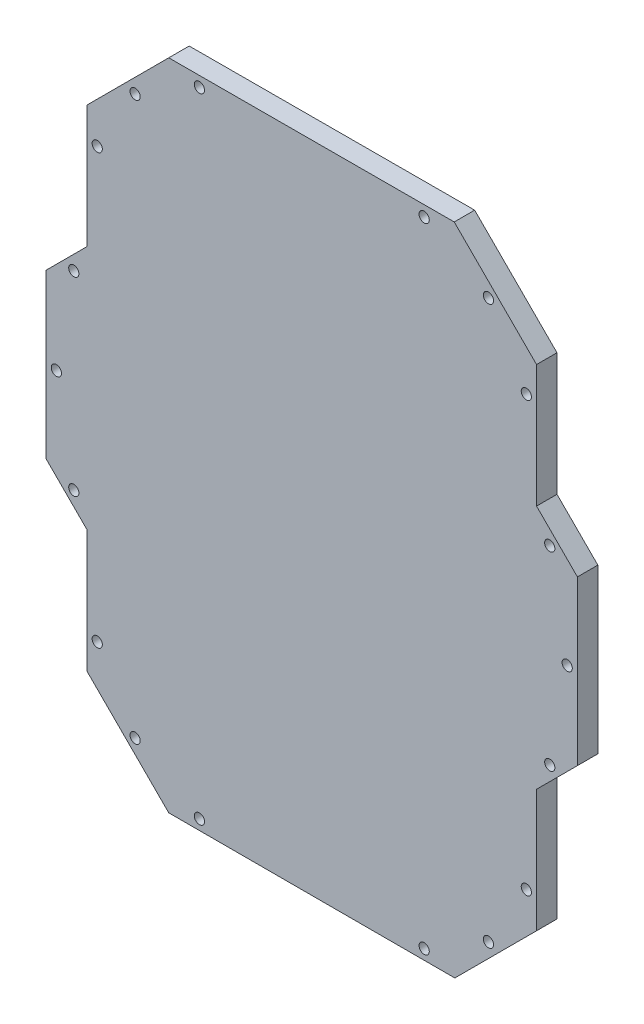
ISO-10303-21;
HEADER;
FILE_DESCRIPTION(('STEP AP214'),'2;1');
FILE_NAME('part.step','',(''),(''),'','','');
FILE_SCHEMA(('AUTOMOTIVE_DESIGN { 1 0 10303 214 1 1 1 1 }'));
ENDSEC;
DATA;
#1=APPLICATION_CONTEXT('core data for automotive mechanical design processes');
#2=APPLICATION_PROTOCOL_DEFINITION('international standard','automotive_design',2000,#1);
#3=PRODUCT_CONTEXT('',#1,'mechanical');
#4=PRODUCT('Part','Part','',(#3));
#5=PRODUCT_RELATED_PRODUCT_CATEGORY('part','',(#4));
#6=PRODUCT_DEFINITION_FORMATION('','',#4);
#7=PRODUCT_DEFINITION_CONTEXT('part definition',#1,'design');
#8=PRODUCT_DEFINITION('design','',#6,#7);
#9=PRODUCT_DEFINITION_SHAPE('','',#8);
#10=(LENGTH_UNIT() NAMED_UNIT(*) SI_UNIT(.MILLI.,.METRE.));
#11=(NAMED_UNIT(*) PLANE_ANGLE_UNIT() SI_UNIT($,.RADIAN.));
#12=(NAMED_UNIT(*) SI_UNIT($,.STERADIAN.) SOLID_ANGLE_UNIT());
#13=UNCERTAINTY_MEASURE_WITH_UNIT(LENGTH_MEASURE(1.E-05),#10,'distance_accuracy_value','');
#14=(GEOMETRIC_REPRESENTATION_CONTEXT(3) GLOBAL_UNCERTAINTY_ASSIGNED_CONTEXT((#13)) GLOBAL_UNIT_ASSIGNED_CONTEXT((#10,
#11,#12)) REPRESENTATION_CONTEXT('',''));
#15=CARTESIAN_POINT('',(0.,0.,0.));
#16=DIRECTION('',(0.,0.,1.));
#17=DIRECTION('',(1.,0.,0.));
#18=AXIS2_PLACEMENT_3D('',#15,#16,#17);
#19=CARTESIAN_POINT('',(0.,0.,5.));
#20=DIRECTION('',(0.,0.,1.));
#21=DIRECTION('',(1.,0.,0.));
#22=AXIS2_PLACEMENT_3D('',#19,#20,#21);
#23=PLANE('',#22);
#24=CARTESIAN_POINT('',(132.555071144139,83.7197596237895,5.));
#25=DIRECTION('',(0.,0.,1.));
#26=DIRECTION('',(1.,0.,0.));
#27=AXIS2_PLACEMENT_3D('',#24,#25,#26);
#28=CIRCLE('',#27,1.25);
#29=CARTESIAN_POINT('',(133.805071144139,83.7197596237895,5.));
#30=VERTEX_POINT('',#29);
#31=EDGE_CURVE('E452',#30,#30,#28,.T.);
#32=ORIENTED_EDGE('',*,*,#31,.F.);
#33=EDGE_LOOP('',(#32));
#34=FACE_BOUND('',#33,.T.);
#35=CARTESIAN_POINT('',(11.8228380971051,106.951992670823,5.));
#36=DIRECTION('',(0.,0.,1.));
#37=DIRECTION('',(1.,0.,0.));
#38=AXIS2_PLACEMENT_3D('',#35,#36,#37);
#39=CIRCLE('',#38,1.25);
#40=CARTESIAN_POINT('',(13.0728380971051,106.951992670823,5.));
#41=VERTEX_POINT('',#40);
#42=EDGE_CURVE('E468',#41,#41,#39,.T.);
#43=ORIENTED_EDGE('',*,*,#42,.F.);
#44=EDGE_LOOP('',(#43));
#45=FACE_BOUND('',#44,.T.);
#46=CARTESIAN_POINT('',(11.8228380971051,60.4875265767559,5.));
#47=DIRECTION('',(0.,0.,1.));
#48=DIRECTION('',(1.,0.,0.));
#49=AXIS2_PLACEMENT_3D('',#46,#47,#48);
#50=CIRCLE('',#49,1.25);
#51=CARTESIAN_POINT('',(13.0728380971051,60.4875265767559,5.));
#52=VERTEX_POINT('',#51);
#53=EDGE_CURVE('E484',#52,#52,#50,.T.);
#54=ORIENTED_EDGE('',*,*,#53,.F.);
#55=EDGE_LOOP('',(#54));
#56=FACE_BOUND('',#55,.T.);
#57=CARTESIAN_POINT('',(17.5550711441387,136.21975962379,5.));
#58=DIRECTION('',(0.,0.,1.));
#59=DIRECTION('',(1.,0.,0.));
#60=AXIS2_PLACEMENT_3D('',#57,#58,#59);
#61=CIRCLE('',#60,1.25);
#62=CARTESIAN_POINT('',(18.8050711441387,136.21975962379,5.));
#63=VERTEX_POINT('',#62);
#64=EDGE_CURVE('E500',#63,#63,#61,.T.);
#65=ORIENTED_EDGE('',*,*,#64,.F.);
#66=EDGE_LOOP('',(#65));
#67=FACE_BOUND('',#66,.T.);
#68=CARTESIAN_POINT('',(113.287304191172,151.951992670823,5.));
#69=DIRECTION('',(0.,0.,1.));
#70=DIRECTION('',(1.,0.,0.));
#71=AXIS2_PLACEMENT_3D('',#68,#69,#70);
#72=CIRCLE('',#71,1.25);
#73=CARTESIAN_POINT('',(114.537304191172,151.951992670823,5.));
#74=VERTEX_POINT('',#73);
#75=EDGE_CURVE('E516',#74,#74,#72,.T.);
#76=ORIENTED_EDGE('',*,*,#75,.F.);
#77=EDGE_LOOP('',(#76));
#78=FACE_BOUND('',#77,.T.);
#79=CARTESIAN_POINT('',(97.5550711441387,161.21975962379,5.));
#80=DIRECTION('',(0.,0.,1.));
#81=DIRECTION('',(1.,0.,0.));
#82=AXIS2_PLACEMENT_3D('',#79,#80,#81);
#83=CIRCLE('',#82,1.25);
#84=CARTESIAN_POINT('',(98.8050711441387,161.21975962379,5.));
#85=VERTEX_POINT('',#84);
#86=EDGE_CURVE('E532',#85,#85,#83,.T.);
#87=ORIENTED_EDGE('',*,*,#86,.F.);
#88=EDGE_LOOP('',(#87));
#89=FACE_BOUND('',#88,.T.);
#90=CARTESIAN_POINT('',(17.5550711441387,31.2197596237895,5.));
#91=DIRECTION('',(0.,0.,1.));
#92=DIRECTION('',(1.,0.,0.));
#93=AXIS2_PLACEMENT_3D('',#90,#91,#92);
#94=CIRCLE('',#93,1.25);
#95=CARTESIAN_POINT('',(18.8050711441387,31.2197596237895,5.));
#96=VERTEX_POINT('',#95);
#97=EDGE_CURVE('E548',#96,#96,#94,.T.);
#98=ORIENTED_EDGE('',*,*,#97,.F.);
#99=EDGE_LOOP('',(#98));
#100=FACE_BOUND('',#99,.T.);
#101=CARTESIAN_POINT('',(113.287304191172,15.4875265767559,5.));
#102=DIRECTION('',(0.,0.,1.));
#103=DIRECTION('',(1.,0.,0.));
#104=AXIS2_PLACEMENT_3D('',#101,#102,#103);
#105=CIRCLE('',#104,1.25);
#106=CARTESIAN_POINT('',(114.537304191172,15.4875265767559,5.));
#107=VERTEX_POINT('',#106);
#108=EDGE_CURVE('E564',#107,#107,#105,.T.);
#109=ORIENTED_EDGE('',*,*,#108,.F.);
#110=EDGE_LOOP('',(#109));
#111=FACE_BOUND('',#110,.T.);
#112=CARTESIAN_POINT('',(97.5550711441387,6.2197596237895,5.));
#113=DIRECTION('',(0.,0.,1.));
#114=DIRECTION('',(1.,0.,0.));
#115=AXIS2_PLACEMENT_3D('',#112,#113,#114);
#116=CIRCLE('',#115,1.25);
#117=CARTESIAN_POINT('',(98.8050711441387,6.2197596237895,5.));
#118=VERTEX_POINT('',#117);
#119=EDGE_CURVE('E194',#118,#118,#116,.T.);
#120=ORIENTED_EDGE('',*,*,#119,.F.);
#121=EDGE_LOOP('',(#120));
#122=FACE_BOUND('',#121,.T.);
#123=DIRECTION('',(1.,0.,0.));
#124=VECTOR('',#123,1.);
#125=CARTESIAN_POINT('',(35.0550711441387,3.7197596237895,5.));
#126=LINE('',#125,#124);
#127=CARTESIAN_POINT('',(35.0550711441387,3.7197596237895,5.));
#128=VERTEX_POINT('',#127);
#129=CARTESIAN_POINT('',(105.055071144139,3.7197596237895,5.));
#130=VERTEX_POINT('',#129);
#131=EDGE_CURVE('E236',#128,#130,#126,.T.);
#132=ORIENTED_EDGE('',*,*,#131,.T.);
#133=DIRECTION('',(0.707106781186548,0.707106781186547,0.));
#134=VECTOR('',#133,1.);
#135=CARTESIAN_POINT('',(105.055071144139,3.7197596237895,5.));
#136=LINE('',#135,#134);
#137=CARTESIAN_POINT('',(125.055071144139,23.7197596237895,5.));
#138=VERTEX_POINT('',#137);
#139=EDGE_CURVE('E124',#130,#138,#136,.T.);
#140=ORIENTED_EDGE('',*,*,#139,.T.);
#141=DIRECTION('',(0.,1.,0.));
#142=VECTOR('',#141,1.);
#143=CARTESIAN_POINT('',(125.055071144139,23.7197596237895,5.));
#144=LINE('',#143,#142);
#145=CARTESIAN_POINT('',(125.055071144139,53.7197596237895,5.));
#146=VERTEX_POINT('',#145);
#147=EDGE_CURVE('E289',#138,#146,#144,.T.);
#148=ORIENTED_EDGE('',*,*,#147,.T.);
#149=DIRECTION('',(0.707106781186546,0.707106781186548,0.));
#150=VECTOR('',#149,1.);
#151=CARTESIAN_POINT('',(135.055071144139,63.7197596237895,5.));
#152=LINE('',#151,#150);
#153=CARTESIAN_POINT('',(135.055071144139,63.7197596237895,5.));
#154=VERTEX_POINT('',#153);
#155=EDGE_CURVE('E309',#146,#154,#152,.T.);
#156=ORIENTED_EDGE('',*,*,#155,.T.);
#157=DIRECTION('',(0.,1.,0.));
#158=VECTOR('',#157,1.);
#159=CARTESIAN_POINT('',(135.055071144139,63.7197596237895,5.));
#160=LINE('',#159,#158);
#161=CARTESIAN_POINT('',(135.055071144139,103.71975962379,5.));
#162=VERTEX_POINT('',#161);
#163=EDGE_CURVE('E305',#154,#162,#160,.T.);
#164=ORIENTED_EDGE('',*,*,#163,.T.);
#165=DIRECTION('',(-0.707106781186546,0.707106781186548,0.));
#166=VECTOR('',#165,1.);
#167=CARTESIAN_POINT('',(135.055071144139,103.71975962379,5.));
#168=LINE('',#167,#166);
#169=CARTESIAN_POINT('',(125.055071144139,113.71975962379,5.));
#170=VERTEX_POINT('',#169);
#171=EDGE_CURVE('E308',#162,#170,#168,.T.);
#172=ORIENTED_EDGE('',*,*,#171,.T.);
#173=DIRECTION('',(0.,1.,0.));
#174=VECTOR('',#173,1.);
#175=CARTESIAN_POINT('',(125.055071144139,143.71975962379,5.));
#176=LINE('',#175,#174);
#177=CARTESIAN_POINT('',(125.055071144139,143.71975962379,5.));
#178=VERTEX_POINT('',#177);
#179=EDGE_CURVE('E313',#170,#178,#176,.T.);
#180=ORIENTED_EDGE('',*,*,#179,.T.);
#181=DIRECTION('',(-0.707106781186548,0.707106781186547,0.));
#182=VECTOR('',#181,1.);
#183=CARTESIAN_POINT('',(104.90983924524,163.864991522689,5.));
#184=LINE('',#183,#182);
#185=CARTESIAN_POINT('',(104.90983924524,163.864991522689,5.));
#186=VERTEX_POINT('',#185);
#187=EDGE_CURVE('E320',#178,#186,#184,.T.);
#188=ORIENTED_EDGE('',*,*,#187,.T.);
#189=DIRECTION('',(-0.999997948982941,-0.00202534686193715,0.));
#190=VECTOR('',#189,1.);
#191=CARTESIAN_POINT('',(35.0588302309645,163.723518710615,5.));
#192=LINE('',#191,#190);
#193=CARTESIAN_POINT('',(35.0588302309645,163.723518710615,5.));
#194=VERTEX_POINT('',#193);
#195=EDGE_CURVE('E323',#186,#194,#192,.T.);
#196=ORIENTED_EDGE('',*,*,#195,.T.);
#197=DIRECTION('',(-0.707106781186548,-0.707106781186548,0.));
#198=VECTOR('',#197,1.);
#199=CARTESIAN_POINT('',(35.0588302309645,163.723518710615,5.));
#200=LINE('',#199,#198);
#201=CARTESIAN_POINT('',(15.0550711441387,143.71975962379,5.));
#202=VERTEX_POINT('',#201);
#203=EDGE_CURVE('E326',#194,#202,#200,.T.);
#204=ORIENTED_EDGE('',*,*,#203,.T.);
#205=DIRECTION('',(0.,-1.,0.));
#206=VECTOR('',#205,1.);
#207=CARTESIAN_POINT('',(15.0550711441387,143.71975962379,5.));
#208=LINE('',#207,#206);
#209=CARTESIAN_POINT('',(15.0550711441387,113.71975962379,5.));
#210=VERTEX_POINT('',#209);
#211=EDGE_CURVE('E329',#202,#210,#208,.T.);
#212=ORIENTED_EDGE('',*,*,#211,.T.);
#213=DIRECTION('',(-0.707106781186547,-0.707106781186548,0.));
#214=VECTOR('',#213,1.);
#215=CARTESIAN_POINT('',(5.05507114413874,103.71975962379,5.));
#216=LINE('',#215,#214);
#217=CARTESIAN_POINT('',(5.05507114413874,103.71975962379,5.));
#218=VERTEX_POINT('',#217);
#219=EDGE_CURVE('E332',#210,#218,#216,.T.);
#220=ORIENTED_EDGE('',*,*,#219,.T.);
#221=DIRECTION('',(0.,-1.,0.));
#222=VECTOR('',#221,1.);
#223=CARTESIAN_POINT('',(5.05507114413874,63.7197596237895,5.));
#224=LINE('',#223,#222);
#225=CARTESIAN_POINT('',(5.05507114413874,63.7197596237895,5.));
#226=VERTEX_POINT('',#225);
#227=EDGE_CURVE('E167',#218,#226,#224,.T.);
#228=ORIENTED_EDGE('',*,*,#227,.T.);
#229=DIRECTION('',(0.707106781186547,-0.707106781186548,0.));
#230=VECTOR('',#229,1.);
#231=CARTESIAN_POINT('',(5.05507114413874,63.7197596237895,5.));
#232=LINE('',#231,#230);
#233=CARTESIAN_POINT('',(15.0550711441387,53.7197596237895,5.));
#234=VERTEX_POINT('',#233);
#235=EDGE_CURVE('E161',#226,#234,#232,.T.);
#236=ORIENTED_EDGE('',*,*,#235,.T.);
#237=DIRECTION('',(0.,-1.,0.));
#238=VECTOR('',#237,1.);
#239=CARTESIAN_POINT('',(15.0550711441387,23.7197596237895,5.));
#240=LINE('',#239,#238);
#241=CARTESIAN_POINT('',(15.0550711441387,23.7197596237895,5.));
#242=VERTEX_POINT('',#241);
#243=EDGE_CURVE('E165',#234,#242,#240,.T.);
#244=ORIENTED_EDGE('',*,*,#243,.T.);
#245=DIRECTION('',(0.707106781186547,-0.707106781186548,0.));
#246=VECTOR('',#245,1.);
#247=CARTESIAN_POINT('',(35.0550711441387,3.7197596237895,5.));
#248=LINE('',#247,#246);
#249=EDGE_CURVE('E57',#242,#128,#248,.T.);
#250=ORIENTED_EDGE('',*,*,#249,.T.);
#251=EDGE_LOOP('',(#132,#140,#148,#156,#164,#172,#180,#188,#196,#204,#212,#220,#228,#236,#244,#250));
#252=FACE_BOUND('',#251,.T.);
#253=CARTESIAN_POINT('',(122.555071144139,31.2197596237895,5.));
#254=DIRECTION('',(0.,0.,1.));
#255=DIRECTION('',(1.,0.,0.));
#256=AXIS2_PLACEMENT_3D('',#253,#254,#255);
#257=CIRCLE('',#256,1.25);
#258=CARTESIAN_POINT('',(123.805071144139,31.2197596237895,5.));
#259=VERTEX_POINT('',#258);
#260=EDGE_CURVE('E572',#259,#259,#257,.T.);
#261=ORIENTED_EDGE('',*,*,#260,.F.);
#262=EDGE_LOOP('',(#261));
#263=FACE_BOUND('',#262,.T.);
#264=CARTESIAN_POINT('',(42.5550711441387,6.2197596237895,5.));
#265=DIRECTION('',(0.,0.,1.));
#266=DIRECTION('',(1.,0.,0.));
#267=AXIS2_PLACEMENT_3D('',#264,#265,#266);
#268=CIRCLE('',#267,1.25);
#269=CARTESIAN_POINT('',(43.8050711441387,6.2197596237895,5.));
#270=VERTEX_POINT('',#269);
#271=EDGE_CURVE('E556',#270,#270,#268,.T.);
#272=ORIENTED_EDGE('',*,*,#271,.F.);
#273=EDGE_LOOP('',(#272));
#274=FACE_BOUND('',#273,.T.);
#275=CARTESIAN_POINT('',(26.8228380971051,15.4875265767559,5.));
#276=DIRECTION('',(0.,0.,1.));
#277=DIRECTION('',(1.,0.,0.));
#278=AXIS2_PLACEMENT_3D('',#275,#276,#277);
#279=CIRCLE('',#278,1.25);
#280=CARTESIAN_POINT('',(28.0728380971051,15.4875265767559,5.));
#281=VERTEX_POINT('',#280);
#282=EDGE_CURVE('E540',#281,#281,#279,.T.);
#283=ORIENTED_EDGE('',*,*,#282,.F.);
#284=EDGE_LOOP('',(#283));
#285=FACE_BOUND('',#284,.T.);
#286=CARTESIAN_POINT('',(122.555071144139,136.21975962379,5.));
#287=DIRECTION('',(0.,0.,1.));
#288=DIRECTION('',(1.,0.,0.));
#289=AXIS2_PLACEMENT_3D('',#286,#287,#288);
#290=CIRCLE('',#289,1.25);
#291=CARTESIAN_POINT('',(123.805071144139,136.21975962379,5.));
#292=VERTEX_POINT('',#291);
#293=EDGE_CURVE('E524',#292,#292,#290,.T.);
#294=ORIENTED_EDGE('',*,*,#293,.F.);
#295=EDGE_LOOP('',(#294));
#296=FACE_BOUND('',#295,.T.);
#297=CARTESIAN_POINT('',(42.5550711441387,161.21975962379,5.));
#298=DIRECTION('',(0.,0.,1.));
#299=DIRECTION('',(1.,0.,0.));
#300=AXIS2_PLACEMENT_3D('',#297,#298,#299);
#301=CIRCLE('',#300,1.25);
#302=CARTESIAN_POINT('',(43.8050711441387,161.21975962379,5.));
#303=VERTEX_POINT('',#302);
#304=EDGE_CURVE('E508',#303,#303,#301,.T.);
#305=ORIENTED_EDGE('',*,*,#304,.F.);
#306=EDGE_LOOP('',(#305));
#307=FACE_BOUND('',#306,.T.);
#308=CARTESIAN_POINT('',(26.8228380971051,151.951992670823,5.));
#309=DIRECTION('',(0.,0.,1.));
#310=DIRECTION('',(1.,0.,0.));
#311=AXIS2_PLACEMENT_3D('',#308,#309,#310);
#312=CIRCLE('',#311,1.25);
#313=CARTESIAN_POINT('',(28.0728380971051,151.951992670823,5.));
#314=VERTEX_POINT('',#313);
#315=EDGE_CURVE('E492',#314,#314,#312,.T.);
#316=ORIENTED_EDGE('',*,*,#315,.F.);
#317=EDGE_LOOP('',(#316));
#318=FACE_BOUND('',#317,.T.);
#319=CARTESIAN_POINT('',(7.55507114413874,83.7197596237895,5.));
#320=DIRECTION('',(0.,0.,1.));
#321=DIRECTION('',(1.,0.,0.));
#322=AXIS2_PLACEMENT_3D('',#319,#320,#321);
#323=CIRCLE('',#322,1.25);
#324=CARTESIAN_POINT('',(8.80507114413874,83.7197596237895,5.));
#325=VERTEX_POINT('',#324);
#326=EDGE_CURVE('E476',#325,#325,#323,.T.);
#327=ORIENTED_EDGE('',*,*,#326,.F.);
#328=EDGE_LOOP('',(#327));
#329=FACE_BOUND('',#328,.T.);
#330=CARTESIAN_POINT('',(128.287304191172,60.4875265767559,5.));
#331=DIRECTION('',(0.,0.,1.));
#332=DIRECTION('',(1.,0.,0.));
#333=AXIS2_PLACEMENT_3D('',#330,#331,#332);
#334=CIRCLE('',#333,1.25);
#335=CARTESIAN_POINT('',(129.537304191172,60.4875265767559,5.));
#336=VERTEX_POINT('',#335);
#337=EDGE_CURVE('E460',#336,#336,#334,.T.);
#338=ORIENTED_EDGE('',*,*,#337,.F.);
#339=EDGE_LOOP('',(#338));
#340=FACE_BOUND('',#339,.T.);
#341=CARTESIAN_POINT('',(128.287304191172,106.951992670823,5.));
#342=DIRECTION('',(0.,0.,1.));
#343=DIRECTION('',(1.,0.,0.));
#344=AXIS2_PLACEMENT_3D('',#341,#342,#343);
#345=CIRCLE('',#344,1.25);
#346=CARTESIAN_POINT('',(129.537304191172,106.951992670823,5.));
#347=VERTEX_POINT('',#346);
#348=EDGE_CURVE('E441',#347,#347,#345,.T.);
#349=ORIENTED_EDGE('',*,*,#348,.F.);
#350=EDGE_LOOP('',(#349));
#351=FACE_BOUND('',#350,.T.);
#352=ADVANCED_FACE('F39',(#34,#45,#56,#67,#78,#89,#100,#111,#122,#252,#263,#274,#285,#296,#307,
#318,#329,#340,#351),#23,.T.);
#353=CARTESIAN_POINT('',(0.,0.,0.));
#354=DIRECTION('',(0.,0.,1.));
#355=DIRECTION('',(1.,0.,0.));
#356=AXIS2_PLACEMENT_3D('',#353,#354,#355);
#357=PLANE('',#356);
#358=DIRECTION('',(1.,0.,0.));
#359=VECTOR('',#358,1.);
#360=CARTESIAN_POINT('',(35.0550711441387,3.7197596237895,0.));
#361=LINE('',#360,#359);
#362=CARTESIAN_POINT('',(35.0550711441387,3.7197596237895,0.));
#363=VERTEX_POINT('',#362);
#364=CARTESIAN_POINT('',(105.055071144139,3.7197596237895,0.));
#365=VERTEX_POINT('',#364);
#366=EDGE_CURVE('E189',#363,#365,#361,.T.);
#367=ORIENTED_EDGE('',*,*,#366,.F.);
#368=DIRECTION('',(0.707106781186547,-0.707106781186548,0.));
#369=VECTOR('',#368,1.);
#370=CARTESIAN_POINT('',(35.0550711441387,3.7197596237895,0.));
#371=LINE('',#370,#369);
#372=CARTESIAN_POINT('',(15.0550711441387,23.7197596237895,0.));
#373=VERTEX_POINT('',#372);
#374=EDGE_CURVE('E116',#373,#363,#371,.T.);
#375=ORIENTED_EDGE('',*,*,#374,.F.);
#376=DIRECTION('',(0.,-1.,0.));
#377=VECTOR('',#376,1.);
#378=CARTESIAN_POINT('',(15.0550711441387,23.7197596237895,0.));
#379=LINE('',#378,#377);
#380=CARTESIAN_POINT('',(15.0550711441387,53.7197596237895,0.));
#381=VERTEX_POINT('',#380);
#382=EDGE_CURVE('E110',#381,#373,#379,.T.);
#383=ORIENTED_EDGE('',*,*,#382,.F.);
#384=DIRECTION('',(0.707106781186547,-0.707106781186548,0.));
#385=VECTOR('',#384,1.);
#386=CARTESIAN_POINT('',(5.05507114413874,63.7197596237895,0.));
#387=LINE('',#386,#385);
#388=CARTESIAN_POINT('',(5.05507114413874,63.7197596237895,0.));
#389=VERTEX_POINT('',#388);
#390=EDGE_CURVE('E176',#389,#381,#387,.T.);
#391=ORIENTED_EDGE('',*,*,#390,.F.);
#392=DIRECTION('',(0.,-1.,0.));
#393=VECTOR('',#392,1.);
#394=CARTESIAN_POINT('',(5.05507114413874,63.7197596237895,0.));
#395=LINE('',#394,#393);
#396=CARTESIAN_POINT('',(5.05507114413874,103.71975962379,0.));
#397=VERTEX_POINT('',#396);
#398=EDGE_CURVE('E227',#397,#389,#395,.T.);
#399=ORIENTED_EDGE('',*,*,#398,.F.);
#400=DIRECTION('',(-0.707106781186547,-0.707106781186548,0.));
#401=VECTOR('',#400,1.);
#402=CARTESIAN_POINT('',(5.05507114413874,103.71975962379,0.));
#403=LINE('',#402,#401);
#404=CARTESIAN_POINT('',(15.0550711441387,113.71975962379,0.));
#405=VERTEX_POINT('',#404);
#406=EDGE_CURVE('E224',#405,#397,#403,.T.);
#407=ORIENTED_EDGE('',*,*,#406,.F.);
#408=DIRECTION('',(0.,-1.,0.));
#409=VECTOR('',#408,1.);
#410=CARTESIAN_POINT('',(15.0550711441387,143.71975962379,0.));
#411=LINE('',#410,#409);
#412=CARTESIAN_POINT('',(15.0550711441387,143.71975962379,0.));
#413=VERTEX_POINT('',#412);
#414=EDGE_CURVE('E221',#413,#405,#411,.T.);
#415=ORIENTED_EDGE('',*,*,#414,.F.);
#416=DIRECTION('',(-0.707106781186548,-0.707106781186548,0.));
#417=VECTOR('',#416,1.);
#418=CARTESIAN_POINT('',(35.0588302309645,163.723518710615,0.));
#419=LINE('',#418,#417);
#420=CARTESIAN_POINT('',(35.0588302309645,163.723518710615,0.));
#421=VERTEX_POINT('',#420);
#422=EDGE_CURVE('E218',#421,#413,#419,.T.);
#423=ORIENTED_EDGE('',*,*,#422,.F.);
#424=DIRECTION('',(-0.999997948982941,-0.00202534686193715,0.));
#425=VECTOR('',#424,1.);
#426=CARTESIAN_POINT('',(35.0588302309645,163.723518710615,0.));
#427=LINE('',#426,#425);
#428=CARTESIAN_POINT('',(104.90983924524,163.864991522689,0.));
#429=VERTEX_POINT('',#428);
#430=EDGE_CURVE('E215',#429,#421,#427,.T.);
#431=ORIENTED_EDGE('',*,*,#430,.F.);
#432=DIRECTION('',(-0.707106781186548,0.707106781186547,0.));
#433=VECTOR('',#432,1.);
#434=CARTESIAN_POINT('',(104.90983924524,163.864991522689,0.));
#435=LINE('',#434,#433);
#436=CARTESIAN_POINT('',(125.055071144139,143.71975962379,0.));
#437=VERTEX_POINT('',#436);
#438=EDGE_CURVE('E212',#437,#429,#435,.T.);
#439=ORIENTED_EDGE('',*,*,#438,.F.);
#440=DIRECTION('',(0.,1.,0.));
#441=VECTOR('',#440,1.);
#442=CARTESIAN_POINT('',(125.055071144139,143.71975962379,0.));
#443=LINE('',#442,#441);
#444=CARTESIAN_POINT('',(125.055071144139,113.71975962379,0.));
#445=VERTEX_POINT('',#444);
#446=EDGE_CURVE('E209',#445,#437,#443,.T.);
#447=ORIENTED_EDGE('',*,*,#446,.F.);
#448=DIRECTION('',(-0.707106781186546,0.707106781186548,0.));
#449=VECTOR('',#448,1.);
#450=CARTESIAN_POINT('',(135.055071144139,103.71975962379,0.));
#451=LINE('',#450,#449);
#452=CARTESIAN_POINT('',(135.055071144139,103.71975962379,0.));
#453=VERTEX_POINT('',#452);
#454=EDGE_CURVE('E206',#453,#445,#451,.T.);
#455=ORIENTED_EDGE('',*,*,#454,.F.);
#456=DIRECTION('',(0.,1.,0.));
#457=VECTOR('',#456,1.);
#458=CARTESIAN_POINT('',(135.055071144139,63.7197596237895,0.));
#459=LINE('',#458,#457);
#460=CARTESIAN_POINT('',(135.055071144139,63.7197596237895,0.));
#461=VERTEX_POINT('',#460);
#462=EDGE_CURVE('E203',#461,#453,#459,.T.);
#463=ORIENTED_EDGE('',*,*,#462,.F.);
#464=DIRECTION('',(0.707106781186546,0.707106781186548,0.));
#465=VECTOR('',#464,1.);
#466=CARTESIAN_POINT('',(135.055071144139,63.7197596237895,0.));
#467=LINE('',#466,#465);
#468=CARTESIAN_POINT('',(125.055071144139,53.7197596237895,0.));
#469=VERTEX_POINT('',#468);
#470=EDGE_CURVE('E200',#469,#461,#467,.T.);
#471=ORIENTED_EDGE('',*,*,#470,.F.);
#472=DIRECTION('',(0.,1.,0.));
#473=VECTOR('',#472,1.);
#474=CARTESIAN_POINT('',(125.055071144139,23.7197596237895,0.));
#475=LINE('',#474,#473);
#476=CARTESIAN_POINT('',(125.055071144139,23.7197596237895,0.));
#477=VERTEX_POINT('',#476);
#478=EDGE_CURVE('E197',#477,#469,#475,.T.);
#479=ORIENTED_EDGE('',*,*,#478,.F.);
#480=DIRECTION('',(0.707106781186548,0.707106781186547,0.));
#481=VECTOR('',#480,1.);
#482=CARTESIAN_POINT('',(105.055071144139,3.7197596237895,0.));
#483=LINE('',#482,#481);
#484=EDGE_CURVE('E193',#365,#477,#483,.T.);
#485=ORIENTED_EDGE('',*,*,#484,.F.);
#486=EDGE_LOOP('',(#367,#375,#383,#391,#399,#407,#415,#423,#431,#439,#447,#455,#463,#471,#479,#485));
#487=FACE_BOUND('',#486,.T.);
#488=CARTESIAN_POINT('',(97.5550711441387,6.2197596237895,0.));
#489=DIRECTION('',(0.,0.,1.));
#490=DIRECTION('',(1.,0.,0.));
#491=AXIS2_PLACEMENT_3D('',#488,#489,#490);
#492=CIRCLE('',#491,1.25);
#493=CARTESIAN_POINT('',(98.8050711441387,6.2197596237895,0.));
#494=VERTEX_POINT('',#493);
#495=EDGE_CURVE('E576',#494,#494,#492,.T.);
#496=ORIENTED_EDGE('',*,*,#495,.T.);
#497=EDGE_LOOP('',(#496));
#498=FACE_BOUND('',#497,.T.);
#499=CARTESIAN_POINT('',(122.555071144139,31.2197596237895,0.));
#500=DIRECTION('',(0.,0.,1.));
#501=DIRECTION('',(1.,0.,0.));
#502=AXIS2_PLACEMENT_3D('',#499,#500,#501);
#503=CIRCLE('',#502,1.25);
#504=CARTESIAN_POINT('',(123.805071144139,31.2197596237895,0.));
#505=VERTEX_POINT('',#504);
#506=EDGE_CURVE('E568',#505,#505,#503,.T.);
#507=ORIENTED_EDGE('',*,*,#506,.T.);
#508=EDGE_LOOP('',(#507));
#509=FACE_BOUND('',#508,.T.);
#510=CARTESIAN_POINT('',(113.287304191172,15.4875265767559,0.));
#511=DIRECTION('',(0.,0.,1.));
#512=DIRECTION('',(1.,0.,0.));
#513=AXIS2_PLACEMENT_3D('',#510,#511,#512);
#514=CIRCLE('',#513,1.25);
#515=CARTESIAN_POINT('',(114.537304191172,15.4875265767559,0.));
#516=VERTEX_POINT('',#515);
#517=EDGE_CURVE('E560',#516,#516,#514,.T.);
#518=ORIENTED_EDGE('',*,*,#517,.T.);
#519=EDGE_LOOP('',(#518));
#520=FACE_BOUND('',#519,.T.);
#521=CARTESIAN_POINT('',(42.5550711441387,6.2197596237895,0.));
#522=DIRECTION('',(0.,0.,1.));
#523=DIRECTION('',(1.,0.,0.));
#524=AXIS2_PLACEMENT_3D('',#521,#522,#523);
#525=CIRCLE('',#524,1.25);
#526=CARTESIAN_POINT('',(43.8050711441387,6.2197596237895,0.));
#527=VERTEX_POINT('',#526);
#528=EDGE_CURVE('E552',#527,#527,#525,.T.);
#529=ORIENTED_EDGE('',*,*,#528,.T.);
#530=EDGE_LOOP('',(#529));
#531=FACE_BOUND('',#530,.T.);
#532=CARTESIAN_POINT('',(17.5550711441387,31.2197596237895,0.));
#533=DIRECTION('',(0.,0.,1.));
#534=DIRECTION('',(1.,0.,0.));
#535=AXIS2_PLACEMENT_3D('',#532,#533,#534);
#536=CIRCLE('',#535,1.25);
#537=CARTESIAN_POINT('',(18.8050711441387,31.2197596237895,0.));
#538=VERTEX_POINT('',#537);
#539=EDGE_CURVE('E544',#538,#538,#536,.T.);
#540=ORIENTED_EDGE('',*,*,#539,.T.);
#541=EDGE_LOOP('',(#540));
#542=FACE_BOUND('',#541,.T.);
#543=CARTESIAN_POINT('',(26.8228380971051,15.4875265767559,0.));
#544=DIRECTION('',(0.,0.,1.));
#545=DIRECTION('',(1.,0.,0.));
#546=AXIS2_PLACEMENT_3D('',#543,#544,#545);
#547=CIRCLE('',#546,1.25);
#548=CARTESIAN_POINT('',(28.0728380971051,15.4875265767559,0.));
#549=VERTEX_POINT('',#548);
#550=EDGE_CURVE('E536',#549,#549,#547,.T.);
#551=ORIENTED_EDGE('',*,*,#550,.T.);
#552=EDGE_LOOP('',(#551));
#553=FACE_BOUND('',#552,.T.);
#554=CARTESIAN_POINT('',(97.5550711441387,161.21975962379,0.));
#555=DIRECTION('',(0.,0.,1.));
#556=DIRECTION('',(1.,0.,0.));
#557=AXIS2_PLACEMENT_3D('',#554,#555,#556);
#558=CIRCLE('',#557,1.25);
#559=CARTESIAN_POINT('',(98.8050711441387,161.21975962379,0.));
#560=VERTEX_POINT('',#559);
#561=EDGE_CURVE('E528',#560,#560,#558,.T.);
#562=ORIENTED_EDGE('',*,*,#561,.T.);
#563=EDGE_LOOP('',(#562));
#564=FACE_BOUND('',#563,.T.);
#565=CARTESIAN_POINT('',(122.555071144139,136.21975962379,0.));
#566=DIRECTION('',(0.,0.,1.));
#567=DIRECTION('',(1.,0.,0.));
#568=AXIS2_PLACEMENT_3D('',#565,#566,#567);
#569=CIRCLE('',#568,1.25);
#570=CARTESIAN_POINT('',(123.805071144139,136.21975962379,0.));
#571=VERTEX_POINT('',#570);
#572=EDGE_CURVE('E520',#571,#571,#569,.T.);
#573=ORIENTED_EDGE('',*,*,#572,.T.);
#574=EDGE_LOOP('',(#573));
#575=FACE_BOUND('',#574,.T.);
#576=CARTESIAN_POINT('',(113.287304191172,151.951992670823,0.));
#577=DIRECTION('',(0.,0.,1.));
#578=DIRECTION('',(1.,0.,0.));
#579=AXIS2_PLACEMENT_3D('',#576,#577,#578);
#580=CIRCLE('',#579,1.25);
#581=CARTESIAN_POINT('',(114.537304191172,151.951992670823,0.));
#582=VERTEX_POINT('',#581);
#583=EDGE_CURVE('E512',#582,#582,#580,.T.);
#584=ORIENTED_EDGE('',*,*,#583,.T.);
#585=EDGE_LOOP('',(#584));
#586=FACE_BOUND('',#585,.T.);
#587=CARTESIAN_POINT('',(42.5550711441387,161.21975962379,0.));
#588=DIRECTION('',(0.,0.,1.));
#589=DIRECTION('',(1.,0.,0.));
#590=AXIS2_PLACEMENT_3D('',#587,#588,#589);
#591=CIRCLE('',#590,1.25);
#592=CARTESIAN_POINT('',(43.8050711441387,161.21975962379,0.));
#593=VERTEX_POINT('',#592);
#594=EDGE_CURVE('E504',#593,#593,#591,.T.);
#595=ORIENTED_EDGE('',*,*,#594,.T.);
#596=EDGE_LOOP('',(#595));
#597=FACE_BOUND('',#596,.T.);
#598=CARTESIAN_POINT('',(17.5550711441387,136.21975962379,0.));
#599=DIRECTION('',(0.,0.,1.));
#600=DIRECTION('',(1.,0.,0.));
#601=AXIS2_PLACEMENT_3D('',#598,#599,#600);
#602=CIRCLE('',#601,1.25);
#603=CARTESIAN_POINT('',(18.8050711441387,136.21975962379,0.));
#604=VERTEX_POINT('',#603);
#605=EDGE_CURVE('E496',#604,#604,#602,.T.);
#606=ORIENTED_EDGE('',*,*,#605,.T.);
#607=EDGE_LOOP('',(#606));
#608=FACE_BOUND('',#607,.T.);
#609=CARTESIAN_POINT('',(26.8228380971051,151.951992670823,0.));
#610=DIRECTION('',(0.,0.,1.));
#611=DIRECTION('',(1.,0.,0.));
#612=AXIS2_PLACEMENT_3D('',#609,#610,#611);
#613=CIRCLE('',#612,1.25);
#614=CARTESIAN_POINT('',(28.0728380971051,151.951992670823,0.));
#615=VERTEX_POINT('',#614);
#616=EDGE_CURVE('E488',#615,#615,#613,.T.);
#617=ORIENTED_EDGE('',*,*,#616,.T.);
#618=EDGE_LOOP('',(#617));
#619=FACE_BOUND('',#618,.T.);
#620=CARTESIAN_POINT('',(11.8228380971051,60.4875265767559,0.));
#621=DIRECTION('',(0.,0.,1.));
#622=DIRECTION('',(1.,0.,0.));
#623=AXIS2_PLACEMENT_3D('',#620,#621,#622);
#624=CIRCLE('',#623,1.25);
#625=CARTESIAN_POINT('',(13.0728380971051,60.4875265767559,0.));
#626=VERTEX_POINT('',#625);
#627=EDGE_CURVE('E480',#626,#626,#624,.T.);
#628=ORIENTED_EDGE('',*,*,#627,.T.);
#629=EDGE_LOOP('',(#628));
#630=FACE_BOUND('',#629,.T.);
#631=CARTESIAN_POINT('',(7.55507114413874,83.7197596237895,0.));
#632=DIRECTION('',(0.,0.,1.));
#633=DIRECTION('',(1.,0.,0.));
#634=AXIS2_PLACEMENT_3D('',#631,#632,#633);
#635=CIRCLE('',#634,1.25);
#636=CARTESIAN_POINT('',(8.80507114413874,83.7197596237895,0.));
#637=VERTEX_POINT('',#636);
#638=EDGE_CURVE('E472',#637,#637,#635,.T.);
#639=ORIENTED_EDGE('',*,*,#638,.T.);
#640=EDGE_LOOP('',(#639));
#641=FACE_BOUND('',#640,.T.);
#642=CARTESIAN_POINT('',(11.8228380971051,106.951992670823,0.));
#643=DIRECTION('',(0.,0.,1.));
#644=DIRECTION('',(1.,0.,0.));
#645=AXIS2_PLACEMENT_3D('',#642,#643,#644);
#646=CIRCLE('',#645,1.25);
#647=CARTESIAN_POINT('',(13.0728380971051,106.951992670823,0.));
#648=VERTEX_POINT('',#647);
#649=EDGE_CURVE('E464',#648,#648,#646,.T.);
#650=ORIENTED_EDGE('',*,*,#649,.T.);
#651=EDGE_LOOP('',(#650));
#652=FACE_BOUND('',#651,.T.);
#653=CARTESIAN_POINT('',(128.287304191172,60.4875265767559,0.));
#654=DIRECTION('',(0.,0.,1.));
#655=DIRECTION('',(1.,0.,0.));
#656=AXIS2_PLACEMENT_3D('',#653,#654,#655);
#657=CIRCLE('',#656,1.25);
#658=CARTESIAN_POINT('',(129.537304191172,60.4875265767559,0.));
#659=VERTEX_POINT('',#658);
#660=EDGE_CURVE('E456',#659,#659,#657,.T.);
#661=ORIENTED_EDGE('',*,*,#660,.T.);
#662=EDGE_LOOP('',(#661));
#663=FACE_BOUND('',#662,.T.);
#664=CARTESIAN_POINT('',(132.555071144139,83.7197596237895,0.));
#665=DIRECTION('',(0.,0.,1.));
#666=DIRECTION('',(1.,0.,0.));
#667=AXIS2_PLACEMENT_3D('',#664,#665,#666);
#668=CIRCLE('',#667,1.25);
#669=CARTESIAN_POINT('',(133.805071144139,83.7197596237895,0.));
#670=VERTEX_POINT('',#669);
#671=EDGE_CURVE('E449',#670,#670,#668,.T.);
#672=ORIENTED_EDGE('',*,*,#671,.T.);
#673=EDGE_LOOP('',(#672));
#674=FACE_BOUND('',#673,.T.);
#675=CARTESIAN_POINT('',(128.287304191172,106.951992670823,0.));
#676=DIRECTION('',(0.,0.,1.));
#677=DIRECTION('',(1.,0.,0.));
#678=AXIS2_PLACEMENT_3D('',#675,#676,#677);
#679=CIRCLE('',#678,1.25);
#680=CARTESIAN_POINT('',(129.537304191172,106.951992670823,0.));
#681=VERTEX_POINT('',#680);
#682=EDGE_CURVE('E444',#681,#681,#679,.T.);
#683=ORIENTED_EDGE('',*,*,#682,.T.);
#684=EDGE_LOOP('',(#683));
#685=FACE_BOUND('',#684,.T.);
#686=ADVANCED_FACE('F293',(#487,#498,#509,#520,#531,#542,#553,#564,#575,#586,#597,#608,#619,
#630,#641,#652,#663,#674,#685),#357,.F.);
#687=CARTESIAN_POINT('',(35.0550711441387,3.7197596237895,5.));
#688=DIRECTION('',(0.,1.,0.));
#689=DIRECTION('',(-1.,0.,0.));
#690=AXIS2_PLACEMENT_3D('',#687,#688,#689);
#691=PLANE('',#690);
#692=ORIENTED_EDGE('',*,*,#366,.T.);
#693=DIRECTION('',(0.,0.,-1.));
#694=VECTOR('',#693,1.);
#695=CARTESIAN_POINT('',(105.055071144139,3.7197596237895,5.));
#696=LINE('',#695,#694);
#697=EDGE_CURVE('E11',#130,#365,#696,.T.);
#698=ORIENTED_EDGE('',*,*,#697,.F.);
#699=ORIENTED_EDGE('',*,*,#131,.F.);
#700=DIRECTION('',(0.,0.,-1.));
#701=VECTOR('',#700,1.);
#702=CARTESIAN_POINT('',(35.0550711441387,3.7197596237895,5.));
#703=LINE('',#702,#701);
#704=EDGE_CURVE('E185',#128,#363,#703,.T.);
#705=ORIENTED_EDGE('',*,*,#704,.T.);
#706=EDGE_LOOP('',(#692,#698,#699,#705));
#707=FACE_BOUND('',#706,.T.);
#708=ADVANCED_FACE('F41',(#707),#691,.F.);
#709=CARTESIAN_POINT('',(105.055071144139,3.7197596237895,5.));
#710=DIRECTION('',(-0.707106781186547,0.707106781186548,0.));
#711=DIRECTION('',(-0.707106781186548,-0.707106781186547,0.));
#712=AXIS2_PLACEMENT_3D('',#709,#710,#711);
#713=PLANE('',#712);
#714=ORIENTED_EDGE('',*,*,#484,.T.);
#715=DIRECTION('',(0.,0.,-1.));
#716=VECTOR('',#715,1.);
#717=CARTESIAN_POINT('',(125.055071144139,23.7197596237895,5.));
#718=LINE('',#717,#716);
#719=EDGE_CURVE('E49',#138,#477,#718,.T.);
#720=ORIENTED_EDGE('',*,*,#719,.F.);
#721=ORIENTED_EDGE('',*,*,#139,.F.);
#722=ORIENTED_EDGE('',*,*,#697,.T.);
#723=EDGE_LOOP('',(#714,#720,#721,#722));
#724=FACE_BOUND('',#723,.T.);
#725=ADVANCED_FACE('F858',(#724),#713,.F.);
#726=CARTESIAN_POINT('',(125.055071144139,23.7197596237895,5.));
#727=DIRECTION('',(-1.,0.,0.));
#728=DIRECTION('',(0.,0.,1.));
#729=AXIS2_PLACEMENT_3D('',#726,#727,#728);
#730=PLANE('',#729);
#731=ORIENTED_EDGE('',*,*,#478,.T.);
#732=DIRECTION('',(0.,0.,-1.));
#733=VECTOR('',#732,1.);
#734=CARTESIAN_POINT('',(125.055071144139,53.7197596237895,5.));
#735=LINE('',#734,#733);
#736=EDGE_CURVE('E279',#146,#469,#735,.T.);
#737=ORIENTED_EDGE('',*,*,#736,.F.);
#738=ORIENTED_EDGE('',*,*,#147,.F.);
#739=ORIENTED_EDGE('',*,*,#719,.T.);
#740=EDGE_LOOP('',(#731,#737,#738,#739));
#741=FACE_BOUND('',#740,.T.);
#742=ADVANCED_FACE('F287',(#741),#730,.F.);
#743=CARTESIAN_POINT('',(135.055071144139,63.7197596237895,5.));
#744=DIRECTION('',(-0.707106781186548,0.707106781186546,0.));
#745=DIRECTION('',(-0.707106781186547,-0.707106781186549,0.));
#746=AXIS2_PLACEMENT_3D('',#743,#744,#745);
#747=PLANE('',#746);
#748=ORIENTED_EDGE('',*,*,#470,.T.);
#749=DIRECTION('',(0.,0.,-1.));
#750=VECTOR('',#749,1.);
#751=CARTESIAN_POINT('',(135.055071144139,63.7197596237895,5.));
#752=LINE('',#751,#750);
#753=EDGE_CURVE('E275',#154,#461,#752,.T.);
#754=ORIENTED_EDGE('',*,*,#753,.F.);
#755=ORIENTED_EDGE('',*,*,#155,.F.);
#756=ORIENTED_EDGE('',*,*,#736,.T.);
#757=EDGE_LOOP('',(#748,#754,#755,#756));
#758=FACE_BOUND('',#757,.T.);
#759=ADVANCED_FACE('F299',(#758),#747,.F.);
#760=CARTESIAN_POINT('',(135.055071144139,63.7197596237895,5.));
#761=DIRECTION('',(-1.,0.,0.));
#762=DIRECTION('',(0.,0.,1.));
#763=AXIS2_PLACEMENT_3D('',#760,#761,#762);
#764=PLANE('',#763);
#765=ORIENTED_EDGE('',*,*,#462,.T.);
#766=DIRECTION('',(0.,0.,-1.));
#767=VECTOR('',#766,1.);
#768=CARTESIAN_POINT('',(135.055071144139,103.71975962379,5.));
#769=LINE('',#768,#767);
#770=EDGE_CURVE('E271',#162,#453,#769,.T.);
#771=ORIENTED_EDGE('',*,*,#770,.F.);
#772=ORIENTED_EDGE('',*,*,#163,.F.);
#773=ORIENTED_EDGE('',*,*,#753,.T.);
#774=EDGE_LOOP('',(#765,#771,#772,#773));
#775=FACE_BOUND('',#774,.T.);
#776=ADVANCED_FACE('F303',(#775),#764,.F.);
#777=CARTESIAN_POINT('',(135.055071144139,103.71975962379,5.));
#778=DIRECTION('',(-0.707106781186548,-0.707106781186546,0.));
#779=DIRECTION('',(0.707106781186547,-0.707106781186549,0.));
#780=AXIS2_PLACEMENT_3D('',#777,#778,#779);
#781=PLANE('',#780);
#782=ORIENTED_EDGE('',*,*,#454,.T.);
#783=DIRECTION('',(0.,0.,-1.));
#784=VECTOR('',#783,1.);
#785=CARTESIAN_POINT('',(125.055071144139,113.71975962379,5.));
#786=LINE('',#785,#784);
#787=EDGE_CURVE('E267',#170,#445,#786,.T.);
#788=ORIENTED_EDGE('',*,*,#787,.F.);
#789=ORIENTED_EDGE('',*,*,#171,.F.);
#790=ORIENTED_EDGE('',*,*,#770,.T.);
#791=EDGE_LOOP('',(#782,#788,#789,#790));
#792=FACE_BOUND('',#791,.T.);
#793=ADVANCED_FACE('F823',(#792),#781,.F.);
#794=CARTESIAN_POINT('',(125.055071144139,143.71975962379,5.));
#795=DIRECTION('',(-1.,0.,0.));
#796=DIRECTION('',(0.,0.,1.));
#797=AXIS2_PLACEMENT_3D('',#794,#795,#796);
#798=PLANE('',#797);
#799=ORIENTED_EDGE('',*,*,#446,.T.);
#800=DIRECTION('',(0.,0.,-1.));
#801=VECTOR('',#800,1.);
#802=CARTESIAN_POINT('',(125.055071144139,143.71975962379,5.));
#803=LINE('',#802,#801);
#804=EDGE_CURVE('E263',#178,#437,#803,.T.);
#805=ORIENTED_EDGE('',*,*,#804,.F.);
#806=ORIENTED_EDGE('',*,*,#179,.F.);
#807=ORIENTED_EDGE('',*,*,#787,.T.);
#808=EDGE_LOOP('',(#799,#805,#806,#807));
#809=FACE_BOUND('',#808,.T.);
#810=ADVANCED_FACE('F813',(#809),#798,.F.);
#811=CARTESIAN_POINT('',(104.90983924524,163.864991522689,5.));
#812=DIRECTION('',(-0.707106781186547,-0.707106781186548,0.));
#813=DIRECTION('',(0.707106781186548,-0.707106781186547,0.));
#814=AXIS2_PLACEMENT_3D('',#811,#812,#813);
#815=PLANE('',#814);
#816=ORIENTED_EDGE('',*,*,#438,.T.);
#817=DIRECTION('',(0.,0.,-1.));
#818=VECTOR('',#817,1.);
#819=CARTESIAN_POINT('',(104.90983924524,163.864991522689,5.));
#820=LINE('',#819,#818);
#821=EDGE_CURVE('E259',#186,#429,#820,.T.);
#822=ORIENTED_EDGE('',*,*,#821,.F.);
#823=ORIENTED_EDGE('',*,*,#187,.F.);
#824=ORIENTED_EDGE('',*,*,#804,.T.);
#825=EDGE_LOOP('',(#816,#822,#823,#824));
#826=FACE_BOUND('',#825,.T.);
#827=ADVANCED_FACE('F803',(#826),#815,.F.);
#828=CARTESIAN_POINT('',(35.0588302309645,163.723518710615,5.));
#829=DIRECTION('',(0.00202534686193715,-0.999997948982941,0.));
#830=DIRECTION('',(0.999997948982941,0.00202534686193715,0.));
#831=AXIS2_PLACEMENT_3D('',#828,#829,#830);
#832=PLANE('',#831);
#833=ORIENTED_EDGE('',*,*,#430,.T.);
#834=DIRECTION('',(0.,0.,-1.));
#835=VECTOR('',#834,1.);
#836=CARTESIAN_POINT('',(35.0588302309645,163.723518710615,5.));
#837=LINE('',#836,#835);
#838=EDGE_CURVE('E255',#194,#421,#837,.T.);
#839=ORIENTED_EDGE('',*,*,#838,.F.);
#840=ORIENTED_EDGE('',*,*,#195,.F.);
#841=ORIENTED_EDGE('',*,*,#821,.T.);
#842=EDGE_LOOP('',(#833,#839,#840,#841));
#843=FACE_BOUND('',#842,.T.);
#844=ADVANCED_FACE('F793',(#843),#832,.F.);
#845=CARTESIAN_POINT('',(35.0588302309645,163.723518710615,5.));
#846=DIRECTION('',(0.707106781186548,-0.707106781186548,0.));
#847=DIRECTION('',(0.707106781186548,0.707106781186548,0.));
#848=AXIS2_PLACEMENT_3D('',#845,#846,#847);
#849=PLANE('',#848);
#850=ORIENTED_EDGE('',*,*,#422,.T.);
#851=DIRECTION('',(0.,0.,-1.));
#852=VECTOR('',#851,1.);
#853=CARTESIAN_POINT('',(15.0550711441387,143.71975962379,5.));
#854=LINE('',#853,#852);
#855=EDGE_CURVE('E251',#202,#413,#854,.T.);
#856=ORIENTED_EDGE('',*,*,#855,.F.);
#857=ORIENTED_EDGE('',*,*,#203,.F.);
#858=ORIENTED_EDGE('',*,*,#838,.T.);
#859=EDGE_LOOP('',(#850,#856,#857,#858));
#860=FACE_BOUND('',#859,.T.);
#861=ADVANCED_FACE('F783',(#860),#849,.F.);
#862=CARTESIAN_POINT('',(15.0550711441387,143.71975962379,5.));
#863=DIRECTION('',(1.,0.,0.));
#864=DIRECTION('',(0.,0.,-1.));
#865=AXIS2_PLACEMENT_3D('',#862,#863,#864);
#866=PLANE('',#865);
#867=ORIENTED_EDGE('',*,*,#414,.T.);
#868=DIRECTION('',(0.,0.,-1.));
#869=VECTOR('',#868,1.);
#870=CARTESIAN_POINT('',(15.0550711441387,113.71975962379,5.));
#871=LINE('',#870,#869);
#872=EDGE_CURVE('E247',#210,#405,#871,.T.);
#873=ORIENTED_EDGE('',*,*,#872,.F.);
#874=ORIENTED_EDGE('',*,*,#211,.F.);
#875=ORIENTED_EDGE('',*,*,#855,.T.);
#876=EDGE_LOOP('',(#867,#873,#874,#875));
#877=FACE_BOUND('',#876,.T.);
#878=ADVANCED_FACE('F774',(#877),#866,.F.);
#879=CARTESIAN_POINT('',(5.05507114413874,103.71975962379,5.));
#880=DIRECTION('',(0.707106781186548,-0.707106781186547,0.));
#881=DIRECTION('',(0.707106781186547,0.707106781186548,0.));
#882=AXIS2_PLACEMENT_3D('',#879,#880,#881);
#883=PLANE('',#882);
#884=ORIENTED_EDGE('',*,*,#406,.T.);
#885=DIRECTION('',(0.,0.,-1.));
#886=VECTOR('',#885,1.);
#887=CARTESIAN_POINT('',(5.05507114413874,103.71975962379,5.));
#888=LINE('',#887,#886);
#889=EDGE_CURVE('E243',#218,#397,#888,.T.);
#890=ORIENTED_EDGE('',*,*,#889,.F.);
#891=ORIENTED_EDGE('',*,*,#219,.F.);
#892=ORIENTED_EDGE('',*,*,#872,.T.);
#893=EDGE_LOOP('',(#884,#890,#891,#892));
#894=FACE_BOUND('',#893,.T.);
#895=ADVANCED_FACE('F340',(#894),#883,.F.);
#896=CARTESIAN_POINT('',(5.05507114413874,63.7197596237895,5.));
#897=DIRECTION('',(1.,0.,0.));
#898=DIRECTION('',(0.,0.,-1.));
#899=AXIS2_PLACEMENT_3D('',#896,#897,#898);
#900=PLANE('',#899);
#901=ORIENTED_EDGE('',*,*,#398,.T.);
#902=DIRECTION('',(0.,0.,-1.));
#903=VECTOR('',#902,1.);
#904=CARTESIAN_POINT('',(5.05507114413874,63.7197596237895,5.));
#905=LINE('',#904,#903);
#906=EDGE_CURVE('E178',#226,#389,#905,.T.);
#907=ORIENTED_EDGE('',*,*,#906,.F.);
#908=ORIENTED_EDGE('',*,*,#227,.F.);
#909=ORIENTED_EDGE('',*,*,#889,.T.);
#910=EDGE_LOOP('',(#901,#907,#908,#909));
#911=FACE_BOUND('',#910,.T.);
#912=ADVANCED_FACE('F344',(#911),#900,.F.);
#913=CARTESIAN_POINT('',(5.05507114413874,63.7197596237895,5.));
#914=DIRECTION('',(0.707106781186548,0.707106781186547,0.));
#915=DIRECTION('',(-0.707106781186547,0.707106781186548,0.));
#916=AXIS2_PLACEMENT_3D('',#913,#914,#915);
#917=PLANE('',#916);
#918=ORIENTED_EDGE('',*,*,#390,.T.);
#919=DIRECTION('',(0.,0.,-1.));
#920=VECTOR('',#919,1.);
#921=CARTESIAN_POINT('',(15.0550711441387,53.7197596237895,5.));
#922=LINE('',#921,#920);
#923=EDGE_CURVE('E173',#234,#381,#922,.T.);
#924=ORIENTED_EDGE('',*,*,#923,.F.);
#925=ORIENTED_EDGE('',*,*,#235,.F.);
#926=ORIENTED_EDGE('',*,*,#906,.T.);
#927=EDGE_LOOP('',(#918,#924,#925,#926));
#928=FACE_BOUND('',#927,.T.);
#929=ADVANCED_FACE('F174',(#928),#917,.F.);
#930=CARTESIAN_POINT('',(15.0550711441387,23.7197596237895,5.));
#931=DIRECTION('',(1.,0.,0.));
#932=DIRECTION('',(0.,0.,-1.));
#933=AXIS2_PLACEMENT_3D('',#930,#931,#932);
#934=PLANE('',#933);
#935=ORIENTED_EDGE('',*,*,#382,.T.);
#936=DIRECTION('',(0.,0.,-1.));
#937=VECTOR('',#936,1.);
#938=CARTESIAN_POINT('',(15.0550711441387,23.7197596237895,5.));
#939=LINE('',#938,#937);
#940=EDGE_CURVE('E179',#242,#373,#939,.T.);
#941=ORIENTED_EDGE('',*,*,#940,.F.);
#942=ORIENTED_EDGE('',*,*,#243,.F.);
#943=ORIENTED_EDGE('',*,*,#923,.T.);
#944=EDGE_LOOP('',(#935,#941,#942,#943));
#945=FACE_BOUND('',#944,.T.);
#946=ADVANCED_FACE('F181',(#945),#934,.F.);
#947=CARTESIAN_POINT('',(35.0550711441387,3.7197596237895,5.));
#948=DIRECTION('',(0.707106781186548,0.707106781186547,0.));
#949=DIRECTION('',(-0.707106781186547,0.707106781186548,0.));
#950=AXIS2_PLACEMENT_3D('',#947,#948,#949);
#951=PLANE('',#950);
#952=ORIENTED_EDGE('',*,*,#374,.T.);
#953=ORIENTED_EDGE('',*,*,#704,.F.);
#954=ORIENTED_EDGE('',*,*,#249,.F.);
#955=ORIENTED_EDGE('',*,*,#940,.T.);
#956=EDGE_LOOP('',(#952,#953,#954,#955));
#957=FACE_BOUND('',#956,.T.);
#958=ADVANCED_FACE('F348',(#957),#951,.F.);
#959=CARTESIAN_POINT('',(97.5550711441387,6.2197596237895,5.));
#960=DIRECTION('',(0.,0.,-1.));
#961=DIRECTION('',(-1.,0.,0.));
#962=AXIS2_PLACEMENT_3D('',#959,#960,#961);
#963=CYLINDRICAL_SURFACE('',#962,1.25);
#964=ORIENTED_EDGE('',*,*,#119,.T.);
#965=EDGE_LOOP('',(#964));
#966=FACE_BOUND('',#965,.T.);
#967=ORIENTED_EDGE('',*,*,#495,.F.);
#968=EDGE_LOOP('',(#967));
#969=FACE_BOUND('',#968,.T.);
#970=ADVANCED_FACE('F350',(#966,#969),#963,.F.);
#971=CARTESIAN_POINT('',(122.555071144139,31.2197596237895,5.));
#972=DIRECTION('',(0.,0.,-1.));
#973=DIRECTION('',(-1.,0.,0.));
#974=AXIS2_PLACEMENT_3D('',#971,#972,#973);
#975=CYLINDRICAL_SURFACE('',#974,1.25);
#976=ORIENTED_EDGE('',*,*,#260,.T.);
#977=EDGE_LOOP('',(#976));
#978=FACE_BOUND('',#977,.T.);
#979=ORIENTED_EDGE('',*,*,#506,.F.);
#980=EDGE_LOOP('',(#979));
#981=FACE_BOUND('',#980,.T.);
#982=ADVANCED_FACE('F356',(#978,#981),#975,.F.);
#983=CARTESIAN_POINT('',(113.287304191172,15.4875265767559,5.));
#984=DIRECTION('',(0.,0.,-1.));
#985=DIRECTION('',(-1.,0.,0.));
#986=AXIS2_PLACEMENT_3D('',#983,#984,#985);
#987=CYLINDRICAL_SURFACE('',#986,1.25);
#988=ORIENTED_EDGE('',*,*,#108,.T.);
#989=EDGE_LOOP('',(#988));
#990=FACE_BOUND('',#989,.T.);
#991=ORIENTED_EDGE('',*,*,#517,.F.);
#992=EDGE_LOOP('',(#991));
#993=FACE_BOUND('',#992,.T.);
#994=ADVANCED_FACE('F372',(#990,#993),#987,.F.);
#995=CARTESIAN_POINT('',(42.5550711441387,6.2197596237895,5.));
#996=DIRECTION('',(0.,0.,-1.));
#997=DIRECTION('',(-1.,0.,0.));
#998=AXIS2_PLACEMENT_3D('',#995,#996,#997);
#999=CYLINDRICAL_SURFACE('',#998,1.25);
#1000=ORIENTED_EDGE('',*,*,#271,.T.);
#1001=EDGE_LOOP('',(#1000));
#1002=FACE_BOUND('',#1001,.T.);
#1003=ORIENTED_EDGE('',*,*,#528,.F.);
#1004=EDGE_LOOP('',(#1003));
#1005=FACE_BOUND('',#1004,.T.);
#1006=ADVANCED_FACE('F376',(#1002,#1005),#999,.F.);
#1007=CARTESIAN_POINT('',(17.5550711441387,31.2197596237895,5.));
#1008=DIRECTION('',(0.,0.,-1.));
#1009=DIRECTION('',(-1.,0.,0.));
#1010=AXIS2_PLACEMENT_3D('',#1007,#1008,#1009);
#1011=CYLINDRICAL_SURFACE('',#1010,1.25);
#1012=ORIENTED_EDGE('',*,*,#97,.T.);
#1013=EDGE_LOOP('',(#1012));
#1014=FACE_BOUND('',#1013,.T.);
#1015=ORIENTED_EDGE('',*,*,#539,.F.);
#1016=EDGE_LOOP('',(#1015));
#1017=FACE_BOUND('',#1016,.T.);
#1018=ADVANCED_FACE('F380',(#1014,#1017),#1011,.F.);
#1019=CARTESIAN_POINT('',(26.8228380971051,15.4875265767559,5.));
#1020=DIRECTION('',(0.,0.,-1.));
#1021=DIRECTION('',(-1.,0.,0.));
#1022=AXIS2_PLACEMENT_3D('',#1019,#1020,#1021);
#1023=CYLINDRICAL_SURFACE('',#1022,1.25);
#1024=ORIENTED_EDGE('',*,*,#282,.T.);
#1025=EDGE_LOOP('',(#1024));
#1026=FACE_BOUND('',#1025,.T.);
#1027=ORIENTED_EDGE('',*,*,#550,.F.);
#1028=EDGE_LOOP('',(#1027));
#1029=FACE_BOUND('',#1028,.T.);
#1030=ADVANCED_FACE('F384',(#1026,#1029),#1023,.F.);
#1031=CARTESIAN_POINT('',(97.5550711441387,161.21975962379,5.));
#1032=DIRECTION('',(0.,0.,-1.));
#1033=DIRECTION('',(-1.,0.,0.));
#1034=AXIS2_PLACEMENT_3D('',#1031,#1032,#1033);
#1035=CYLINDRICAL_SURFACE('',#1034,1.25);
#1036=ORIENTED_EDGE('',*,*,#86,.T.);
#1037=EDGE_LOOP('',(#1036));
#1038=FACE_BOUND('',#1037,.T.);
#1039=ORIENTED_EDGE('',*,*,#561,.F.);
#1040=EDGE_LOOP('',(#1039));
#1041=FACE_BOUND('',#1040,.T.);
#1042=ADVANCED_FACE('F388',(#1038,#1041),#1035,.F.);
#1043=CARTESIAN_POINT('',(122.555071144139,136.21975962379,5.));
#1044=DIRECTION('',(0.,0.,-1.));
#1045=DIRECTION('',(-1.,0.,0.));
#1046=AXIS2_PLACEMENT_3D('',#1043,#1044,#1045);
#1047=CYLINDRICAL_SURFACE('',#1046,1.25);
#1048=ORIENTED_EDGE('',*,*,#293,.T.);
#1049=EDGE_LOOP('',(#1048));
#1050=FACE_BOUND('',#1049,.T.);
#1051=ORIENTED_EDGE('',*,*,#572,.F.);
#1052=EDGE_LOOP('',(#1051));
#1053=FACE_BOUND('',#1052,.T.);
#1054=ADVANCED_FACE('F392',(#1050,#1053),#1047,.F.);
#1055=CARTESIAN_POINT('',(113.287304191172,151.951992670823,5.));
#1056=DIRECTION('',(0.,0.,-1.));
#1057=DIRECTION('',(-1.,0.,0.));
#1058=AXIS2_PLACEMENT_3D('',#1055,#1056,#1057);
#1059=CYLINDRICAL_SURFACE('',#1058,1.25);
#1060=ORIENTED_EDGE('',*,*,#75,.T.);
#1061=EDGE_LOOP('',(#1060));
#1062=FACE_BOUND('',#1061,.T.);
#1063=ORIENTED_EDGE('',*,*,#583,.F.);
#1064=EDGE_LOOP('',(#1063));
#1065=FACE_BOUND('',#1064,.T.);
#1066=ADVANCED_FACE('F396',(#1062,#1065),#1059,.F.);
#1067=CARTESIAN_POINT('',(42.5550711441387,161.21975962379,5.));
#1068=DIRECTION('',(0.,0.,-1.));
#1069=DIRECTION('',(-1.,0.,0.));
#1070=AXIS2_PLACEMENT_3D('',#1067,#1068,#1069);
#1071=CYLINDRICAL_SURFACE('',#1070,1.25);
#1072=ORIENTED_EDGE('',*,*,#304,.T.);
#1073=EDGE_LOOP('',(#1072));
#1074=FACE_BOUND('',#1073,.T.);
#1075=ORIENTED_EDGE('',*,*,#594,.F.);
#1076=EDGE_LOOP('',(#1075));
#1077=FACE_BOUND('',#1076,.T.);
#1078=ADVANCED_FACE('F400',(#1074,#1077),#1071,.F.);
#1079=CARTESIAN_POINT('',(17.5550711441387,136.21975962379,5.));
#1080=DIRECTION('',(0.,0.,-1.));
#1081=DIRECTION('',(-1.,0.,0.));
#1082=AXIS2_PLACEMENT_3D('',#1079,#1080,#1081);
#1083=CYLINDRICAL_SURFACE('',#1082,1.25);
#1084=ORIENTED_EDGE('',*,*,#64,.T.);
#1085=EDGE_LOOP('',(#1084));
#1086=FACE_BOUND('',#1085,.T.);
#1087=ORIENTED_EDGE('',*,*,#605,.F.);
#1088=EDGE_LOOP('',(#1087));
#1089=FACE_BOUND('',#1088,.T.);
#1090=ADVANCED_FACE('F404',(#1086,#1089),#1083,.F.);
#1091=CARTESIAN_POINT('',(26.8228380971051,151.951992670823,5.));
#1092=DIRECTION('',(0.,0.,-1.));
#1093=DIRECTION('',(-1.,0.,0.));
#1094=AXIS2_PLACEMENT_3D('',#1091,#1092,#1093);
#1095=CYLINDRICAL_SURFACE('',#1094,1.25);
#1096=ORIENTED_EDGE('',*,*,#315,.T.);
#1097=EDGE_LOOP('',(#1096));
#1098=FACE_BOUND('',#1097,.T.);
#1099=ORIENTED_EDGE('',*,*,#616,.F.);
#1100=EDGE_LOOP('',(#1099));
#1101=FACE_BOUND('',#1100,.T.);
#1102=ADVANCED_FACE('F408',(#1098,#1101),#1095,.F.);
#1103=CARTESIAN_POINT('',(11.8228380971051,60.4875265767559,5.));
#1104=DIRECTION('',(0.,0.,-1.));
#1105=DIRECTION('',(-1.,0.,0.));
#1106=AXIS2_PLACEMENT_3D('',#1103,#1104,#1105);
#1107=CYLINDRICAL_SURFACE('',#1106,1.25);
#1108=ORIENTED_EDGE('',*,*,#53,.T.);
#1109=EDGE_LOOP('',(#1108));
#1110=FACE_BOUND('',#1109,.T.);
#1111=ORIENTED_EDGE('',*,*,#627,.F.);
#1112=EDGE_LOOP('',(#1111));
#1113=FACE_BOUND('',#1112,.T.);
#1114=ADVANCED_FACE('F412',(#1110,#1113),#1107,.F.);
#1115=CARTESIAN_POINT('',(7.55507114413874,83.7197596237895,5.));
#1116=DIRECTION('',(0.,0.,-1.));
#1117=DIRECTION('',(-1.,0.,0.));
#1118=AXIS2_PLACEMENT_3D('',#1115,#1116,#1117);
#1119=CYLINDRICAL_SURFACE('',#1118,1.25);
#1120=ORIENTED_EDGE('',*,*,#326,.T.);
#1121=EDGE_LOOP('',(#1120));
#1122=FACE_BOUND('',#1121,.T.);
#1123=ORIENTED_EDGE('',*,*,#638,.F.);
#1124=EDGE_LOOP('',(#1123));
#1125=FACE_BOUND('',#1124,.T.);
#1126=ADVANCED_FACE('F416',(#1122,#1125),#1119,.F.);
#1127=CARTESIAN_POINT('',(11.8228380971051,106.951992670823,5.));
#1128=DIRECTION('',(0.,0.,-1.));
#1129=DIRECTION('',(-1.,0.,0.));
#1130=AXIS2_PLACEMENT_3D('',#1127,#1128,#1129);
#1131=CYLINDRICAL_SURFACE('',#1130,1.25);
#1132=ORIENTED_EDGE('',*,*,#42,.T.);
#1133=EDGE_LOOP('',(#1132));
#1134=FACE_BOUND('',#1133,.T.);
#1135=ORIENTED_EDGE('',*,*,#649,.F.);
#1136=EDGE_LOOP('',(#1135));
#1137=FACE_BOUND('',#1136,.T.);
#1138=ADVANCED_FACE('F420',(#1134,#1137),#1131,.F.);
#1139=CARTESIAN_POINT('',(128.287304191172,60.4875265767559,5.));
#1140=DIRECTION('',(0.,0.,-1.));
#1141=DIRECTION('',(-1.,0.,0.));
#1142=AXIS2_PLACEMENT_3D('',#1139,#1140,#1141);
#1143=CYLINDRICAL_SURFACE('',#1142,1.25);
#1144=ORIENTED_EDGE('',*,*,#337,.T.);
#1145=EDGE_LOOP('',(#1144));
#1146=FACE_BOUND('',#1145,.T.);
#1147=ORIENTED_EDGE('',*,*,#660,.F.);
#1148=EDGE_LOOP('',(#1147));
#1149=FACE_BOUND('',#1148,.T.);
#1150=ADVANCED_FACE('F424',(#1146,#1149),#1143,.F.);
#1151=CARTESIAN_POINT('',(132.555071144139,83.7197596237895,5.));
#1152=DIRECTION('',(0.,0.,-1.));
#1153=DIRECTION('',(-1.,0.,0.));
#1154=AXIS2_PLACEMENT_3D('',#1151,#1152,#1153);
#1155=CYLINDRICAL_SURFACE('',#1154,1.25);
#1156=ORIENTED_EDGE('',*,*,#31,.T.);
#1157=EDGE_LOOP('',(#1156));
#1158=FACE_BOUND('',#1157,.T.);
#1159=ORIENTED_EDGE('',*,*,#671,.F.);
#1160=EDGE_LOOP('',(#1159));
#1161=FACE_BOUND('',#1160,.T.);
#1162=ADVANCED_FACE('F428',(#1158,#1161),#1155,.F.);
#1163=CARTESIAN_POINT('',(128.287304191172,106.951992670823,5.));
#1164=DIRECTION('',(0.,0.,-1.));
#1165=DIRECTION('',(-1.,0.,0.));
#1166=AXIS2_PLACEMENT_3D('',#1163,#1164,#1165);
#1167=CYLINDRICAL_SURFACE('',#1166,1.25);
#1168=ORIENTED_EDGE('',*,*,#348,.T.);
#1169=EDGE_LOOP('',(#1168));
#1170=FACE_BOUND('',#1169,.T.);
#1171=ORIENTED_EDGE('',*,*,#682,.F.);
#1172=EDGE_LOOP('',(#1171));
#1173=FACE_BOUND('',#1172,.T.);
#1174=ADVANCED_FACE('F432',(#1170,#1173),#1167,.F.);
#1175=CLOSED_SHELL('',(#352,#686,#708,#725,#742,#759,#776,#793,#810,#827,#844,#861,#878,#895,
#912,#929,#946,#958,#970,#982,#994,#1006,#1018,#1030,#1042,#1054,#1066,#1078,#1090,#1102,#1114,
#1126,#1138,#1150,#1162,#1174));
#1176=MANIFOLD_SOLID_BREP('B2',#1175);
#1177=ADVANCED_BREP_SHAPE_REPRESENTATION('',(#18,#1176),#14);
#1178=SHAPE_DEFINITION_REPRESENTATION(#9,#1177);
ENDSEC;
END-ISO-10303-21;
